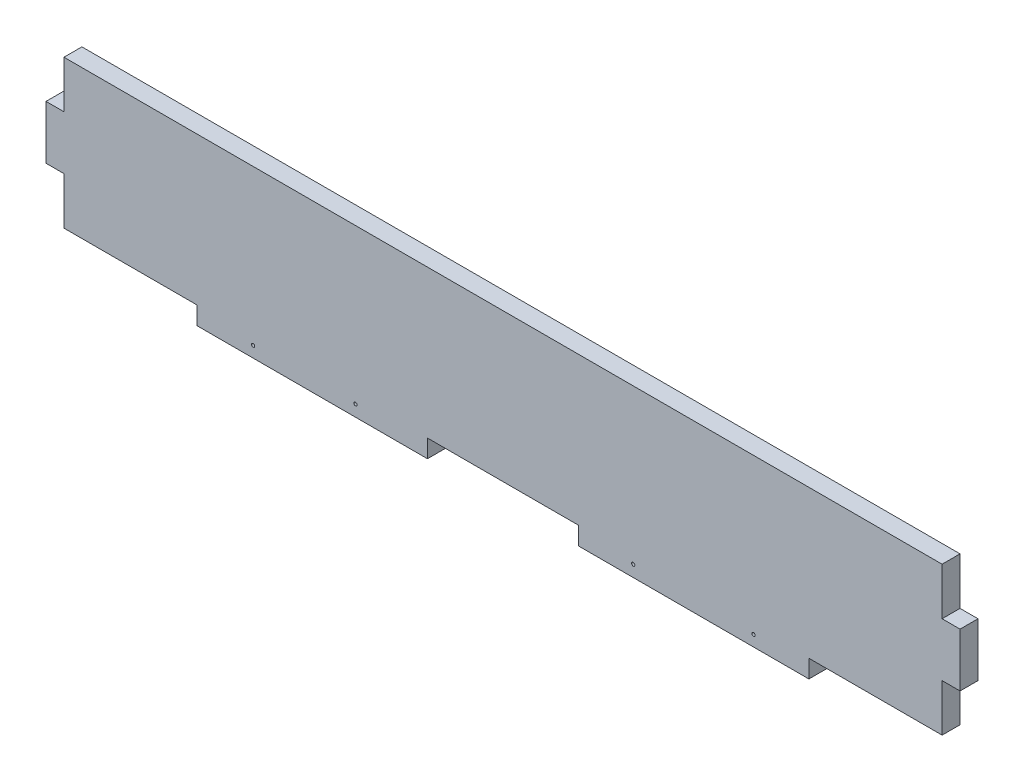
ISO-10303-21;
HEADER;
FILE_DESCRIPTION(('STEP AP214'),'2;1');
FILE_NAME('part.step','',(''),(''),'','','');
FILE_SCHEMA(('AUTOMOTIVE_DESIGN { 1 0 10303 214 1 1 1 1 }'));
ENDSEC;
DATA;
#1=APPLICATION_CONTEXT('core data for automotive mechanical design processes');
#2=APPLICATION_PROTOCOL_DEFINITION('international standard','automotive_design',2000,#1);
#3=PRODUCT_CONTEXT('',#1,'mechanical');
#4=PRODUCT('Part','Part','',(#3));
#5=PRODUCT_RELATED_PRODUCT_CATEGORY('part','',(#4));
#6=PRODUCT_DEFINITION_FORMATION('','',#4);
#7=PRODUCT_DEFINITION_CONTEXT('part definition',#1,'design');
#8=PRODUCT_DEFINITION('design','',#6,#7);
#9=PRODUCT_DEFINITION_SHAPE('','',#8);
#10=(LENGTH_UNIT() NAMED_UNIT(*) SI_UNIT(.MILLI.,.METRE.));
#11=(NAMED_UNIT(*) PLANE_ANGLE_UNIT() SI_UNIT($,.RADIAN.));
#12=(NAMED_UNIT(*) SI_UNIT($,.STERADIAN.) SOLID_ANGLE_UNIT());
#13=UNCERTAINTY_MEASURE_WITH_UNIT(LENGTH_MEASURE(1.E-05),#10,'distance_accuracy_value','');
#14=(GEOMETRIC_REPRESENTATION_CONTEXT(3) GLOBAL_UNCERTAINTY_ASSIGNED_CONTEXT((#13)) GLOBAL_UNIT_ASSIGNED_CONTEXT((#10,
#11,#12)) REPRESENTATION_CONTEXT('',''));
#15=CARTESIAN_POINT('',(0.,0.,0.));
#16=DIRECTION('',(0.,0.,1.));
#17=DIRECTION('',(1.,0.,0.));
#18=AXIS2_PLACEMENT_3D('',#15,#16,#17);
#19=CARTESIAN_POINT('',(-929.418408841076,3374.03154429096,208.));
#20=DIRECTION('',(-1.,0.,0.));
#21=DIRECTION('',(0.,0.,1.));
#22=AXIS2_PLACEMENT_3D('',#19,#20,#21);
#23=PLANE('',#22);
#24=DIRECTION('',(0.,1.,0.));
#25=VECTOR('',#24,1.);
#26=CARTESIAN_POINT('',(-929.418408841076,3374.03154429096,189.));
#27=LINE('',#26,#25);
#28=CARTESIAN_POINT('',(-929.418408841076,3267.30154429096,189.));
#29=VERTEX_POINT('',#28);
#30=CARTESIAN_POINT('',(-929.418408841076,3324.02154429096,189.));
#31=VERTEX_POINT('',#30);
#32=EDGE_CURVE('E343',#29,#31,#27,.T.);
#33=ORIENTED_EDGE('',*,*,#32,.T.);
#34=DIRECTION('',(0.,0.,-1.));
#35=VECTOR('',#34,1.);
#36=CARTESIAN_POINT('',(-929.418408841076,3324.02154429096,208.));
#37=LINE('',#36,#35);
#38=CARTESIAN_POINT('',(-929.418408841076,3324.02154429096,208.));
#39=VERTEX_POINT('',#38);
#40=EDGE_CURVE('E178',#39,#31,#37,.T.);
#41=ORIENTED_EDGE('',*,*,#40,.F.);
#42=DIRECTION('',(0.,1.,0.));
#43=VECTOR('',#42,1.);
#44=CARTESIAN_POINT('',(-929.418408841076,3374.03154429096,208.));
#45=LINE('',#44,#43);
#46=CARTESIAN_POINT('',(-929.418408841076,3267.30154429096,208.));
#47=VERTEX_POINT('',#46);
#48=EDGE_CURVE('E344',#47,#39,#45,.T.);
#49=ORIENTED_EDGE('',*,*,#48,.F.);
#50=DIRECTION('',(0.,0.,1.));
#51=VECTOR('',#50,1.);
#52=CARTESIAN_POINT('',(-929.418408841076,3267.30154429096,208.));
#53=LINE('',#52,#51);
#54=EDGE_CURVE('E224',#29,#47,#53,.T.);
#55=ORIENTED_EDGE('',*,*,#54,.F.);
#56=EDGE_LOOP('',(#33,#41,#49,#55));
#57=FACE_BOUND('',#56,.T.);
#58=ADVANCED_FACE('F33',(#57),#23,.F.);
#59=CARTESIAN_POINT('',(-929.418408841076,3198.29154429096,208.));
#60=DIRECTION('',(0.,1.,0.));
#61=DIRECTION('',(0.,0.,1.));
#62=AXIS2_PLACEMENT_3D('',#59,#60,#61);
#63=PLANE('',#62);
#64=DIRECTION('',(0.,0.,-1.));
#65=VECTOR('',#64,1.);
#66=CARTESIAN_POINT('',(-1089.42840884108,3198.29154429096,208.));
#67=LINE('',#66,#65);
#68=CARTESIAN_POINT('',(-1089.42840884108,3198.29154429096,208.));
#69=VERTEX_POINT('',#68);
#70=CARTESIAN_POINT('',(-1089.42840884108,3198.29154429096,189.));
#71=VERTEX_POINT('',#70);
#72=EDGE_CURVE('E302',#69,#71,#67,.T.);
#73=ORIENTED_EDGE('',*,*,#72,.F.);
#74=DIRECTION('',(1.,0.,0.));
#75=VECTOR('',#74,1.);
#76=CARTESIAN_POINT('',(-929.418408841076,3198.29154429096,208.));
#77=LINE('',#76,#75);
#78=CARTESIAN_POINT('',(-1333.20840884108,3198.29154429096,208.));
#79=VERTEX_POINT('',#78);
#80=EDGE_CURVE('E353',#79,#69,#77,.T.);
#81=ORIENTED_EDGE('',*,*,#80,.F.);
#82=DIRECTION('',(0.,0.,1.));
#83=VECTOR('',#82,1.);
#84=CARTESIAN_POINT('',(-1333.20840884108,3198.29154429096,208.));
#85=LINE('',#84,#83);
#86=CARTESIAN_POINT('',(-1333.20840884108,3198.29154429096,189.));
#87=VERTEX_POINT('',#86);
#88=EDGE_CURVE('E300',#87,#79,#85,.T.);
#89=ORIENTED_EDGE('',*,*,#88,.F.);
#90=DIRECTION('',(1.,0.,0.));
#91=VECTOR('',#90,1.);
#92=CARTESIAN_POINT('',(-929.418408841076,3198.29154429096,189.));
#93=LINE('',#92,#91);
#94=EDGE_CURVE('E362',#87,#71,#93,.T.);
#95=ORIENTED_EDGE('',*,*,#94,.T.);
#96=EDGE_LOOP('',(#73,#81,#89,#95));
#97=FACE_BOUND('',#96,.T.);
#98=ADVANCED_FACE('F380',(#97),#63,.F.);
#99=DIRECTION('',(0.,0.,-1.));
#100=VECTOR('',#99,1.);
#101=CARTESIAN_POINT('',(-1493.22840884108,3198.29154429096,208.));
#102=LINE('',#101,#100);
#103=CARTESIAN_POINT('',(-1493.22840884108,3198.29154429096,208.));
#104=VERTEX_POINT('',#103);
#105=CARTESIAN_POINT('',(-1493.22840884108,3198.29154429096,189.));
#106=VERTEX_POINT('',#105);
#107=EDGE_CURVE('E298',#104,#106,#102,.T.);
#108=ORIENTED_EDGE('',*,*,#107,.F.);
#109=CARTESIAN_POINT('',(-1737.00840884108,3198.29154429096,208.));
#110=VERTEX_POINT('',#109);
#111=EDGE_CURVE('E356',#110,#104,#77,.T.);
#112=ORIENTED_EDGE('',*,*,#111,.F.);
#113=DIRECTION('',(0.,0.,1.));
#114=VECTOR('',#113,1.);
#115=CARTESIAN_POINT('',(-1737.00840884108,3198.29154429096,208.));
#116=LINE('',#115,#114);
#117=CARTESIAN_POINT('',(-1737.00840884108,3198.29154429096,189.));
#118=VERTEX_POINT('',#117);
#119=EDGE_CURVE('E230',#118,#110,#116,.T.);
#120=ORIENTED_EDGE('',*,*,#119,.F.);
#121=EDGE_CURVE('E348',#118,#106,#93,.T.);
#122=ORIENTED_EDGE('',*,*,#121,.T.);
#123=EDGE_LOOP('',(#108,#112,#120,#122));
#124=FACE_BOUND('',#123,.T.);
#125=ADVANCED_FACE('F394',(#124),#63,.F.);
#126=CARTESIAN_POINT('',(0.,0.,208.));
#127=DIRECTION('',(0.,0.,-1.));
#128=DIRECTION('',(-1.,0.,0.));
#129=AXIS2_PLACEMENT_3D('',#126,#127,#128);
#130=PLANE('',#129);
#131=CARTESIAN_POINT('',(-1148.04493942285,3209.86722089998,208.));
#132=DIRECTION('',(0.,0.,-1.));
#133=DIRECTION('',(-1.,0.,0.));
#134=AXIS2_PLACEMENT_3D('',#131,#132,#133);
#135=CIRCLE('',#134,1.70000000000003);
#136=CARTESIAN_POINT('',(-1149.74493942285,3209.86722089998,208.));
#137=VERTEX_POINT('',#136);
#138=EDGE_CURVE('E485',#137,#137,#135,.T.);
#139=ORIENTED_EDGE('',*,*,#138,.T.);
#140=EDGE_LOOP('',(#139));
#141=FACE_BOUND('',#140,.T.);
#142=CARTESIAN_POINT('',(-1275.39820574207,3210.48579021909,208.));
#143=DIRECTION('',(0.,0.,-1.));
#144=DIRECTION('',(-1.,0.,0.));
#145=AXIS2_PLACEMENT_3D('',#142,#143,#144);
#146=CIRCLE('',#145,1.70000000000003);
#147=CARTESIAN_POINT('',(-1277.09820574207,3210.48579021909,208.));
#148=VERTEX_POINT('',#147);
#149=EDGE_CURVE('E489',#148,#148,#146,.T.);
#150=ORIENTED_EDGE('',*,*,#149,.T.);
#151=EDGE_LOOP('',(#150));
#152=FACE_BOUND('',#151,.T.);
#153=CARTESIAN_POINT('',(-1569.39828744184,3210.35876800607,208.));
#154=DIRECTION('',(0.,0.,-1.));
#155=DIRECTION('',(-1.,0.,0.));
#156=AXIS2_PLACEMENT_3D('',#153,#154,#155);
#157=CIRCLE('',#156,1.70000000000003);
#158=CARTESIAN_POINT('',(-1571.09828744184,3210.35876800607,208.));
#159=VERTEX_POINT('',#158);
#160=EDGE_CURVE('E493',#159,#159,#157,.T.);
#161=ORIENTED_EDGE('',*,*,#160,.T.);
#162=EDGE_LOOP('',(#161));
#163=FACE_BOUND('',#162,.T.);
#164=CARTESIAN_POINT('',(-1677.74929869736,3210.03773707743,208.));
#165=DIRECTION('',(0.,0.,-1.));
#166=DIRECTION('',(-1.,0.,0.));
#167=AXIS2_PLACEMENT_3D('',#164,#165,#166);
#168=CIRCLE('',#167,1.70000000000003);
#169=CARTESIAN_POINT('',(-1679.44929869736,3210.03773707743,208.));
#170=VERTEX_POINT('',#169);
#171=EDGE_CURVE('E188',#170,#170,#168,.T.);
#172=ORIENTED_EDGE('',*,*,#171,.T.);
#173=EDGE_LOOP('',(#172));
#174=FACE_BOUND('',#173,.T.);
#175=ORIENTED_EDGE('',*,*,#48,.T.);
#176=DIRECTION('',(-1.,0.,0.));
#177=VECTOR('',#176,1.);
#178=CARTESIAN_POINT('',(-948.428408841075,3324.02154429096,208.));
#179=LINE('',#178,#177);
#180=CARTESIAN_POINT('',(-948.428408841075,3324.02154429096,208.));
#181=VERTEX_POINT('',#180);
#182=EDGE_CURVE('E182',#39,#181,#179,.T.);
#183=ORIENTED_EDGE('',*,*,#182,.T.);
#184=DIRECTION('',(0.,1.,0.));
#185=VECTOR('',#184,1.);
#186=CARTESIAN_POINT('',(-948.428408841075,3374.04154429096,208.));
#187=LINE('',#186,#185);
#188=CARTESIAN_POINT('',(-948.428408841075,3374.03154429096,208.));
#189=VERTEX_POINT('',#188);
#190=EDGE_CURVE('E170',#181,#189,#187,.T.);
#191=ORIENTED_EDGE('',*,*,#190,.T.);
#192=DIRECTION('',(-1.,0.,0.));
#193=VECTOR('',#192,1.);
#194=CARTESIAN_POINT('',(-929.418408841076,3374.03154429096,208.));
#195=LINE('',#194,#193);
#196=CARTESIAN_POINT('',(-1878.00840884108,3374.03154429096,208.));
#197=VERTEX_POINT('',#196);
#198=EDGE_CURVE('E347',#189,#197,#195,.T.);
#199=ORIENTED_EDGE('',*,*,#198,.T.);
#200=DIRECTION('',(0.,1.,0.));
#201=VECTOR('',#200,1.);
#202=CARTESIAN_POINT('',(-1878.00840884108,3374.04154429096,208.));
#203=LINE('',#202,#201);
#204=CARTESIAN_POINT('',(-1878.00840884108,3324.02154429096,208.));
#205=VERTEX_POINT('',#204);
#206=EDGE_CURVE('E305',#205,#197,#203,.T.);
#207=ORIENTED_EDGE('',*,*,#206,.F.);
#208=DIRECTION('',(1.,0.,0.));
#209=VECTOR('',#208,1.);
#210=CARTESIAN_POINT('',(-1878.00840884108,3324.02154429096,208.));
#211=LINE('',#210,#209);
#212=CARTESIAN_POINT('',(-1897.01840884108,3324.02154429096,208.));
#213=VERTEX_POINT('',#212);
#214=EDGE_CURVE('E308',#213,#205,#211,.T.);
#215=ORIENTED_EDGE('',*,*,#214,.F.);
#216=DIRECTION('',(0.,-1.,0.));
#217=VECTOR('',#216,1.);
#218=CARTESIAN_POINT('',(-1897.01840884108,3374.03154429096,208.));
#219=LINE('',#218,#217);
#220=CARTESIAN_POINT('',(-1897.01840884108,3267.30154429096,208.));
#221=VERTEX_POINT('',#220);
#222=EDGE_CURVE('E350',#213,#221,#219,.T.);
#223=ORIENTED_EDGE('',*,*,#222,.T.);
#224=DIRECTION('',(-1.,0.,0.));
#225=VECTOR('',#224,1.);
#226=CARTESIAN_POINT('',(-1897.02840884108,3267.30154429096,208.));
#227=LINE('',#226,#225);
#228=CARTESIAN_POINT('',(-1878.00840884108,3267.30154429096,208.));
#229=VERTEX_POINT('',#228);
#230=EDGE_CURVE('E322',#229,#221,#227,.T.);
#231=ORIENTED_EDGE('',*,*,#230,.F.);
#232=DIRECTION('',(0.,1.,0.));
#233=VECTOR('',#232,1.);
#234=CARTESIAN_POINT('',(-1878.00840884108,3267.30154429096,208.));
#235=LINE('',#234,#233);
#236=CARTESIAN_POINT('',(-1878.00840884108,3217.30154429096,208.));
#237=VERTEX_POINT('',#236);
#238=EDGE_CURVE('E316',#237,#229,#235,.T.);
#239=ORIENTED_EDGE('',*,*,#238,.F.);
#240=DIRECTION('',(1.,0.,0.));
#241=VECTOR('',#240,1.);
#242=CARTESIAN_POINT('',(-1737.00840884108,3217.30154429096,208.));
#243=LINE('',#242,#241);
#244=CARTESIAN_POINT('',(-1737.00840884108,3217.30154429096,208.));
#245=VERTEX_POINT('',#244);
#246=EDGE_CURVE('E277',#237,#245,#243,.T.);
#247=ORIENTED_EDGE('',*,*,#246,.T.);
#248=DIRECTION('',(0.,-1.,0.));
#249=VECTOR('',#248,1.);
#250=CARTESIAN_POINT('',(-1737.00840884108,3198.28154429097,208.));
#251=LINE('',#250,#249);
#252=EDGE_CURVE('E258',#245,#110,#251,.T.);
#253=ORIENTED_EDGE('',*,*,#252,.T.);
#254=ORIENTED_EDGE('',*,*,#111,.T.);
#255=DIRECTION('',(0.,1.,0.));
#256=VECTOR('',#255,1.);
#257=CARTESIAN_POINT('',(-1493.22840884108,3217.30154429096,208.));
#258=LINE('',#257,#256);
#259=CARTESIAN_POINT('',(-1493.22840884108,3217.30154429096,208.));
#260=VERTEX_POINT('',#259);
#261=EDGE_CURVE('E238',#104,#260,#258,.T.);
#262=ORIENTED_EDGE('',*,*,#261,.T.);
#263=DIRECTION('',(1.,0.,0.));
#264=VECTOR('',#263,1.);
#265=CARTESIAN_POINT('',(-1333.20840884108,3217.30154429096,208.));
#266=LINE('',#265,#264);
#267=CARTESIAN_POINT('',(-1333.20840884108,3217.30154429096,208.));
#268=VERTEX_POINT('',#267);
#269=EDGE_CURVE('E249',#260,#268,#266,.T.);
#270=ORIENTED_EDGE('',*,*,#269,.T.);
#271=DIRECTION('',(0.,-1.,0.));
#272=VECTOR('',#271,1.);
#273=CARTESIAN_POINT('',(-1333.20840884108,3198.28154429097,208.));
#274=LINE('',#273,#272);
#275=EDGE_CURVE('E246',#268,#79,#274,.T.);
#276=ORIENTED_EDGE('',*,*,#275,.T.);
#277=ORIENTED_EDGE('',*,*,#80,.T.);
#278=DIRECTION('',(0.,1.,0.));
#279=VECTOR('',#278,1.);
#280=CARTESIAN_POINT('',(-1089.42840884108,3217.30154429096,208.));
#281=LINE('',#280,#279);
#282=CARTESIAN_POINT('',(-1089.42840884108,3217.30154429096,208.));
#283=VERTEX_POINT('',#282);
#284=EDGE_CURVE('E227',#69,#283,#281,.T.);
#285=ORIENTED_EDGE('',*,*,#284,.T.);
#286=DIRECTION('',(1.,0.,0.));
#287=VECTOR('',#286,1.);
#288=CARTESIAN_POINT('',(-929.408408841076,3217.30154429096,208.));
#289=LINE('',#288,#287);
#290=CARTESIAN_POINT('',(-948.428408841075,3217.30154429096,208.));
#291=VERTEX_POINT('',#290);
#292=EDGE_CURVE('E231',#283,#291,#289,.T.);
#293=ORIENTED_EDGE('',*,*,#292,.T.);
#294=DIRECTION('',(0.,1.,0.));
#295=VECTOR('',#294,1.);
#296=CARTESIAN_POINT('',(-948.428408841075,3267.30154429096,208.));
#297=LINE('',#296,#295);
#298=CARTESIAN_POINT('',(-948.428408841075,3267.30154429096,208.));
#299=VERTEX_POINT('',#298);
#300=EDGE_CURVE('E55',#291,#299,#297,.T.);
#301=ORIENTED_EDGE('',*,*,#300,.T.);
#302=DIRECTION('',(1.,0.,0.));
#303=VECTOR('',#302,1.);
#304=CARTESIAN_POINT('',(-929.408408841075,3267.30154429096,208.));
#305=LINE('',#304,#303);
#306=EDGE_CURVE('E221',#299,#47,#305,.T.);
#307=ORIENTED_EDGE('',*,*,#306,.T.);
#308=EDGE_LOOP('',(#175,#183,#191,#199,#207,#215,#223,#231,#239,#247,#253,#254,#262,#270,#276,
#277,#285,#293,#301,#307));
#309=FACE_BOUND('',#308,.T.);
#310=ADVANCED_FACE('F382',(#141,#152,#163,#174,#309),#130,.F.);
#311=CARTESIAN_POINT('',(0.,0.,189.));
#312=DIRECTION('',(0.,0.,-1.));
#313=DIRECTION('',(-1.,0.,0.));
#314=AXIS2_PLACEMENT_3D('',#311,#312,#313);
#315=PLANE('',#314);
#316=CARTESIAN_POINT('',(-1148.04493942285,3209.86722089998,189.));
#317=DIRECTION('',(0.,0.,-1.));
#318=DIRECTION('',(-1.,0.,0.));
#319=AXIS2_PLACEMENT_3D('',#316,#317,#318);
#320=CIRCLE('',#319,1.70000000000003);
#321=CARTESIAN_POINT('',(-1149.74493942285,3209.86722089998,189.));
#322=VERTEX_POINT('',#321);
#323=EDGE_CURVE('E514',#322,#322,#320,.T.);
#324=ORIENTED_EDGE('',*,*,#323,.F.);
#325=EDGE_LOOP('',(#324));
#326=FACE_BOUND('',#325,.T.);
#327=CARTESIAN_POINT('',(-1275.39820574207,3210.48579021909,189.));
#328=DIRECTION('',(0.,0.,-1.));
#329=DIRECTION('',(-1.,0.,0.));
#330=AXIS2_PLACEMENT_3D('',#327,#328,#329);
#331=CIRCLE('',#330,1.70000000000003);
#332=CARTESIAN_POINT('',(-1277.09820574207,3210.48579021909,189.));
#333=VERTEX_POINT('',#332);
#334=EDGE_CURVE('E510',#333,#333,#331,.T.);
#335=ORIENTED_EDGE('',*,*,#334,.F.);
#336=EDGE_LOOP('',(#335));
#337=FACE_BOUND('',#336,.T.);
#338=CARTESIAN_POINT('',(-1569.39828744184,3210.35876800607,189.));
#339=DIRECTION('',(0.,0.,-1.));
#340=DIRECTION('',(-1.,0.,0.));
#341=AXIS2_PLACEMENT_3D('',#338,#339,#340);
#342=CIRCLE('',#341,1.70000000000003);
#343=CARTESIAN_POINT('',(-1571.09828744184,3210.35876800607,189.));
#344=VERTEX_POINT('',#343);
#345=EDGE_CURVE('E504',#344,#344,#342,.T.);
#346=ORIENTED_EDGE('',*,*,#345,.F.);
#347=EDGE_LOOP('',(#346));
#348=FACE_BOUND('',#347,.T.);
#349=CARTESIAN_POINT('',(-1677.74929869736,3210.03773707743,189.));
#350=DIRECTION('',(0.,0.,-1.));
#351=DIRECTION('',(-1.,0.,0.));
#352=AXIS2_PLACEMENT_3D('',#349,#350,#351);
#353=CIRCLE('',#352,1.70000000000003);
#354=CARTESIAN_POINT('',(-1679.44929869736,3210.03773707743,189.));
#355=VERTEX_POINT('',#354);
#356=EDGE_CURVE('E191',#355,#355,#353,.T.);
#357=ORIENTED_EDGE('',*,*,#356,.F.);
#358=EDGE_LOOP('',(#357));
#359=FACE_BOUND('',#358,.T.);
#360=CARTESIAN_POINT('',(-948.428408841075,3324.02154429096,189.));
#361=CARTESIAN_POINT('',(-929.408408841075,3324.02154429096,189.));
#362=B_SPLINE_CURVE_WITH_KNOTS('',1,(#360,#361),.UNSPECIFIED.,.F.,.F.,(2,2),(0.,
0.137746234067208),.UNSPECIFIED.);
#363=CARTESIAN_POINT('',(-948.428408841075,3324.02154429096,189.));
#364=VERTEX_POINT('',#363);
#365=EDGE_CURVE('E175',#364,#31,#362,.T.);
#366=ORIENTED_EDGE('',*,*,#365,.T.);
#367=ORIENTED_EDGE('',*,*,#32,.F.);
#368=DIRECTION('',(-1.,0.,0.));
#369=VECTOR('',#368,1.);
#370=CARTESIAN_POINT('',(-2826.43681768215,3267.30154429096,189.));
#371=LINE('',#370,#369);
#372=CARTESIAN_POINT('',(-948.428408841075,3267.30154429096,189.));
#373=VERTEX_POINT('',#372);
#374=EDGE_CURVE('E215',#29,#373,#371,.T.);
#375=ORIENTED_EDGE('',*,*,#374,.T.);
#376=CARTESIAN_POINT('',(-948.428408841075,3267.30154429096,189.));
#377=CARTESIAN_POINT('',(-948.428408841075,3217.28154429096,189.));
#378=B_SPLINE_CURVE_WITH_KNOTS('',1,(#376,#377),.UNSPECIFIED.,.F.,.F.,(2,2),(0.637746234067208,
1.),.UNSPECIFIED.);
#379=CARTESIAN_POINT('',(-948.428408841075,3217.30154429096,189.));
#380=VERTEX_POINT('',#379);
#381=EDGE_CURVE('E210',#373,#380,#378,.T.);
#382=ORIENTED_EDGE('',*,*,#381,.T.);
#383=DIRECTION('',(-1.,0.,0.));
#384=VECTOR('',#383,1.);
#385=CARTESIAN_POINT('',(0.,3217.30154429096,189.));
#386=LINE('',#385,#384);
#387=CARTESIAN_POINT('',(-1089.42840884108,3217.30154429096,189.));
#388=VERTEX_POINT('',#387);
#389=EDGE_CURVE('E11',#380,#388,#386,.T.);
#390=ORIENTED_EDGE('',*,*,#389,.T.);
#391=CARTESIAN_POINT('',(-1089.42840884108,3217.30154429096,189.));
#392=CARTESIAN_POINT('',(-1089.42840884108,3198.28154429097,189.));
#393=B_SPLINE_CURVE_WITH_KNOTS('',1,(#391,#392),.UNSPECIFIED.,.F.,.F.,(2,2),(0.,
0.0531166219839137),.UNSPECIFIED.);
#394=EDGE_CURVE('E232',#388,#71,#393,.T.);
#395=ORIENTED_EDGE('',*,*,#394,.T.);
#396=ORIENTED_EDGE('',*,*,#94,.F.);
#397=DIRECTION('',(0.,1.,0.));
#398=VECTOR('',#397,1.);
#399=CARTESIAN_POINT('',(-1333.20840884108,0.,189.));
#400=LINE('',#399,#398);
#401=CARTESIAN_POINT('',(-1333.20840884108,3217.30154429096,189.));
#402=VERTEX_POINT('',#401);
#403=EDGE_CURVE('E40',#87,#402,#400,.T.);
#404=ORIENTED_EDGE('',*,*,#403,.T.);
#405=CARTESIAN_POINT('',(-1333.20840884108,3217.30154429096,189.));
#406=CARTESIAN_POINT('',(-1493.22840884108,3217.30154429096,189.));
#407=B_SPLINE_CURVE_WITH_KNOTS('',1,(#405,#406),.UNSPECIFIED.,.F.,.F.,(2,2),(0.553116621983914,
1.),.UNSPECIFIED.);
#408=CARTESIAN_POINT('',(-1493.22840884108,3217.30154429096,189.));
#409=VERTEX_POINT('',#408);
#410=EDGE_CURVE('E257',#402,#409,#407,.T.);
#411=ORIENTED_EDGE('',*,*,#410,.T.);
#412=CARTESIAN_POINT('',(-1493.22840884108,3217.30154429096,189.));
#413=CARTESIAN_POINT('',(-1493.22840884108,3198.28154429097,189.));
#414=B_SPLINE_CURVE_WITH_KNOTS('',1,(#412,#413),.UNSPECIFIED.,.F.,.F.,(2,2),(0.,
0.0531166219839137),.UNSPECIFIED.);
#415=EDGE_CURVE('E252',#409,#106,#414,.T.);
#416=ORIENTED_EDGE('',*,*,#415,.T.);
#417=ORIENTED_EDGE('',*,*,#121,.F.);
#418=CARTESIAN_POINT('',(-1737.00840884108,3198.28154429097,189.));
#419=CARTESIAN_POINT('',(-1737.00840884108,3217.30154429096,189.));
#420=B_SPLINE_CURVE_WITH_KNOTS('',1,(#418,#419),.UNSPECIFIED.,.F.,.F.,(2,2),(0.5,
0.553116621983914),.UNSPECIFIED.);
#421=CARTESIAN_POINT('',(-1737.00840884108,3217.30154429096,189.));
#422=VERTEX_POINT('',#421);
#423=EDGE_CURVE('E226',#118,#422,#420,.T.);
#424=ORIENTED_EDGE('',*,*,#423,.T.);
#425=CARTESIAN_POINT('',(-1737.00840884108,3217.30154429096,189.));
#426=CARTESIAN_POINT('',(-1897.02840884108,3217.30154429096,189.));
#427=B_SPLINE_CURVE_WITH_KNOTS('',1,(#425,#426),.UNSPECIFIED.,.F.,.F.,(2,2),(0.553116621983914,
1.),.UNSPECIFIED.);
#428=CARTESIAN_POINT('',(-1878.00840884108,3217.30154429096,189.));
#429=VERTEX_POINT('',#428);
#430=EDGE_CURVE('E282',#422,#429,#427,.T.);
#431=ORIENTED_EDGE('',*,*,#430,.T.);
#432=CARTESIAN_POINT('',(-1878.00840884108,3267.30154429096,189.));
#433=CARTESIAN_POINT('',(-1878.00840884108,3217.28154429096,189.));
#434=B_SPLINE_CURVE_WITH_KNOTS('',1,(#432,#433),.UNSPECIFIED.,.F.,.F.,(2,2),(0.637746234067208,
1.),.UNSPECIFIED.);
#435=CARTESIAN_POINT('',(-1878.00840884108,3267.30154429096,189.));
#436=VERTEX_POINT('',#435);
#437=EDGE_CURVE('E304',#436,#429,#434,.T.);
#438=ORIENTED_EDGE('',*,*,#437,.F.);
#439=DIRECTION('',(1.,0.,0.));
#440=VECTOR('',#439,1.);
#441=CARTESIAN_POINT('',(0.,3267.30154429096,189.));
#442=LINE('',#441,#440);
#443=CARTESIAN_POINT('',(-1897.01840884108,3267.30154429096,189.));
#444=VERTEX_POINT('',#443);
#445=EDGE_CURVE('E365',#444,#436,#442,.T.);
#446=ORIENTED_EDGE('',*,*,#445,.F.);
#447=DIRECTION('',(0.,-1.,0.));
#448=VECTOR('',#447,1.);
#449=CARTESIAN_POINT('',(-1897.01840884108,3374.03154429096,189.));
#450=LINE('',#449,#448);
#451=CARTESIAN_POINT('',(-1897.01840884108,3324.02154429096,189.));
#452=VERTEX_POINT('',#451);
#453=EDGE_CURVE('E359',#452,#444,#450,.T.);
#454=ORIENTED_EDGE('',*,*,#453,.F.);
#455=CARTESIAN_POINT('',(-1878.00840884108,3324.02154429096,189.));
#456=CARTESIAN_POINT('',(-1897.02840884108,3324.02154429096,189.));
#457=B_SPLINE_CURVE_WITH_KNOTS('',1,(#455,#456),.UNSPECIFIED.,.F.,.F.,(2,2),(0.,
0.137746234067208),.UNSPECIFIED.);
#458=CARTESIAN_POINT('',(-1878.00840884108,3324.02154429096,189.));
#459=VERTEX_POINT('',#458);
#460=EDGE_CURVE('E312',#459,#452,#457,.T.);
#461=ORIENTED_EDGE('',*,*,#460,.F.);
#462=DIRECTION('',(0.,-1.,0.));
#463=VECTOR('',#462,1.);
#464=CARTESIAN_POINT('',(-1878.00840884108,0.,189.));
#465=LINE('',#464,#463);
#466=CARTESIAN_POINT('',(-1878.00840884108,3374.03154429096,189.));
#467=VERTEX_POINT('',#466);
#468=EDGE_CURVE('E367',#467,#459,#465,.T.);
#469=ORIENTED_EDGE('',*,*,#468,.F.);
#470=DIRECTION('',(-1.,0.,0.));
#471=VECTOR('',#470,1.);
#472=CARTESIAN_POINT('',(-929.418408841076,3374.03154429096,189.));
#473=LINE('',#472,#471);
#474=CARTESIAN_POINT('',(-948.428408841075,3374.03154429096,189.));
#475=VERTEX_POINT('',#474);
#476=EDGE_CURVE('E187',#475,#467,#473,.T.);
#477=ORIENTED_EDGE('',*,*,#476,.F.);
#478=DIRECTION('',(0.,-1.,0.));
#479=VECTOR('',#478,1.);
#480=CARTESIAN_POINT('',(-948.428408841075,0.,189.));
#481=LINE('',#480,#479);
#482=EDGE_CURVE('E47',#475,#364,#481,.T.);
#483=ORIENTED_EDGE('',*,*,#482,.T.);
#484=EDGE_LOOP('',(#366,#367,#375,#382,#390,#395,#396,#404,#411,#416,#417,#424,#431,#438,#446,
#454,#461,#469,#477,#483));
#485=FACE_BOUND('',#484,.T.);
#486=ADVANCED_FACE('F185',(#326,#337,#348,#359,#485),#315,.T.);
#487=CARTESIAN_POINT('',(-1878.00840884108,3267.30154429096,227.));
#488=DIRECTION('',(1.,0.,0.));
#489=DIRECTION('',(0.,0.,-1.));
#490=AXIS2_PLACEMENT_3D('',#487,#488,#489);
#491=PLANE('',#490);
#492=DIRECTION('',(0.,0.,-1.));
#493=VECTOR('',#492,1.);
#494=CARTESIAN_POINT('',(-1878.00840884108,3217.30154429096,227.));
#495=LINE('',#494,#493);
#496=EDGE_CURVE('E369',#237,#429,#495,.T.);
#497=ORIENTED_EDGE('',*,*,#496,.F.);
#498=ORIENTED_EDGE('',*,*,#238,.T.);
#499=DIRECTION('',(0.,0.,-1.));
#500=VECTOR('',#499,1.);
#501=CARTESIAN_POINT('',(-1878.00840884108,3267.30154429096,227.));
#502=LINE('',#501,#500);
#503=EDGE_CURVE('E324',#229,#436,#502,.T.);
#504=ORIENTED_EDGE('',*,*,#503,.T.);
#505=ORIENTED_EDGE('',*,*,#437,.T.);
#506=EDGE_LOOP('',(#497,#498,#504,#505));
#507=FACE_BOUND('',#506,.T.);
#508=ADVANCED_FACE('F407',(#507),#491,.F.);
#509=CARTESIAN_POINT('',(-929.418408841076,3374.03154429096,208.));
#510=DIRECTION('',(0.,-1.,0.));
#511=DIRECTION('',(0.,0.,-1.));
#512=AXIS2_PLACEMENT_3D('',#509,#510,#511);
#513=PLANE('',#512);
#514=ORIENTED_EDGE('',*,*,#198,.F.);
#515=DIRECTION('',(0.,0.,1.));
#516=VECTOR('',#515,1.);
#517=CARTESIAN_POINT('',(-948.428408841075,3374.03154429096,208.));
#518=LINE('',#517,#516);
#519=EDGE_CURVE('E196',#475,#189,#518,.T.);
#520=ORIENTED_EDGE('',*,*,#519,.F.);
#521=ORIENTED_EDGE('',*,*,#476,.T.);
#522=DIRECTION('',(0.,0.,1.));
#523=VECTOR('',#522,1.);
#524=CARTESIAN_POINT('',(-1878.00840884108,3374.03154429096,208.));
#525=LINE('',#524,#523);
#526=EDGE_CURVE('E337',#467,#197,#525,.T.);
#527=ORIENTED_EDGE('',*,*,#526,.T.);
#528=EDGE_LOOP('',(#514,#520,#521,#527));
#529=FACE_BOUND('',#528,.T.);
#530=ADVANCED_FACE('F427',(#529),#513,.F.);
#531=CARTESIAN_POINT('',(-1897.01840884108,3374.03154429096,208.));
#532=DIRECTION('',(1.,0.,0.));
#533=DIRECTION('',(0.,0.,-1.));
#534=AXIS2_PLACEMENT_3D('',#531,#532,#533);
#535=PLANE('',#534);
#536=ORIENTED_EDGE('',*,*,#222,.F.);
#537=DIRECTION('',(0.,0.,-1.));
#538=VECTOR('',#537,1.);
#539=CARTESIAN_POINT('',(-1897.01840884108,3324.02154429096,208.));
#540=LINE('',#539,#538);
#541=EDGE_CURVE('E340',#213,#452,#540,.T.);
#542=ORIENTED_EDGE('',*,*,#541,.T.);
#543=ORIENTED_EDGE('',*,*,#453,.T.);
#544=DIRECTION('',(0.,0.,1.));
#545=VECTOR('',#544,1.);
#546=CARTESIAN_POINT('',(-1897.01840884108,3267.30154429096,208.));
#547=LINE('',#546,#545);
#548=EDGE_CURVE('E311',#444,#221,#547,.T.);
#549=ORIENTED_EDGE('',*,*,#548,.T.);
#550=EDGE_LOOP('',(#536,#542,#543,#549));
#551=FACE_BOUND('',#550,.T.);
#552=ADVANCED_FACE('F416',(#551),#535,.F.);
#553=CARTESIAN_POINT('',(-1897.02840884108,3267.30154429096,227.));
#554=DIRECTION('',(0.,1.,0.));
#555=DIRECTION('',(0.,0.,1.));
#556=AXIS2_PLACEMENT_3D('',#553,#554,#555);
#557=PLANE('',#556);
#558=ORIENTED_EDGE('',*,*,#445,.T.);
#559=ORIENTED_EDGE('',*,*,#503,.F.);
#560=ORIENTED_EDGE('',*,*,#230,.T.);
#561=ORIENTED_EDGE('',*,*,#548,.F.);
#562=EDGE_LOOP('',(#558,#559,#560,#561));
#563=FACE_BOUND('',#562,.T.);
#564=ADVANCED_FACE('F464',(#563),#557,.F.);
#565=CARTESIAN_POINT('',(-1878.00840884108,3324.02154429096,227.));
#566=DIRECTION('',(0.,-1.,0.));
#567=DIRECTION('',(0.,0.,-1.));
#568=AXIS2_PLACEMENT_3D('',#565,#566,#567);
#569=PLANE('',#568);
#570=ORIENTED_EDGE('',*,*,#214,.T.);
#571=DIRECTION('',(0.,0.,-1.));
#572=VECTOR('',#571,1.);
#573=CARTESIAN_POINT('',(-1878.00840884108,3324.02154429096,227.));
#574=LINE('',#573,#572);
#575=EDGE_CURVE('E309',#205,#459,#574,.T.);
#576=ORIENTED_EDGE('',*,*,#575,.T.);
#577=ORIENTED_EDGE('',*,*,#460,.T.);
#578=ORIENTED_EDGE('',*,*,#541,.F.);
#579=EDGE_LOOP('',(#570,#576,#577,#578));
#580=FACE_BOUND('',#579,.T.);
#581=ADVANCED_FACE('F419',(#580),#569,.F.);
#582=CARTESIAN_POINT('',(-1878.00840884108,3374.04154429096,227.));
#583=DIRECTION('',(1.,0.,0.));
#584=DIRECTION('',(0.,0.,-1.));
#585=AXIS2_PLACEMENT_3D('',#582,#583,#584);
#586=PLANE('',#585);
#587=ORIENTED_EDGE('',*,*,#468,.T.);
#588=ORIENTED_EDGE('',*,*,#575,.F.);
#589=ORIENTED_EDGE('',*,*,#206,.T.);
#590=ORIENTED_EDGE('',*,*,#526,.F.);
#591=EDGE_LOOP('',(#587,#588,#589,#590));
#592=FACE_BOUND('',#591,.T.);
#593=ADVANCED_FACE('F425',(#592),#586,.F.);
#594=CARTESIAN_POINT('',(-1737.00840884108,3198.28154429097,227.));
#595=DIRECTION('',(-1.,0.,0.));
#596=DIRECTION('',(0.,0.,1.));
#597=AXIS2_PLACEMENT_3D('',#594,#595,#596);
#598=PLANE('',#597);
#599=ORIENTED_EDGE('',*,*,#119,.T.);
#600=ORIENTED_EDGE('',*,*,#252,.F.);
#601=DIRECTION('',(0.,0.,-1.));
#602=VECTOR('',#601,1.);
#603=CARTESIAN_POINT('',(-1737.00840884108,3217.30154429096,227.));
#604=LINE('',#603,#602);
#605=EDGE_CURVE('E290',#245,#422,#604,.T.);
#606=ORIENTED_EDGE('',*,*,#605,.T.);
#607=ORIENTED_EDGE('',*,*,#423,.F.);
#608=EDGE_LOOP('',(#599,#600,#606,#607));
#609=FACE_BOUND('',#608,.T.);
#610=ADVANCED_FACE('F398',(#609),#598,.T.);
#611=CARTESIAN_POINT('',(-1737.00840884108,3217.30154429096,227.));
#612=DIRECTION('',(0.,-1.,0.));
#613=DIRECTION('',(0.,0.,-1.));
#614=AXIS2_PLACEMENT_3D('',#611,#612,#613);
#615=PLANE('',#614);
#616=ORIENTED_EDGE('',*,*,#496,.T.);
#617=ORIENTED_EDGE('',*,*,#430,.F.);
#618=ORIENTED_EDGE('',*,*,#605,.F.);
#619=ORIENTED_EDGE('',*,*,#246,.F.);
#620=EDGE_LOOP('',(#616,#617,#618,#619));
#621=FACE_BOUND('',#620,.T.);
#622=ADVANCED_FACE('F404',(#621),#615,.T.);
#623=CARTESIAN_POINT('',(-1333.20840884108,3198.28154429097,227.));
#624=DIRECTION('',(-1.,0.,0.));
#625=DIRECTION('',(0.,0.,1.));
#626=AXIS2_PLACEMENT_3D('',#623,#624,#625);
#627=PLANE('',#626);
#628=ORIENTED_EDGE('',*,*,#88,.T.);
#629=ORIENTED_EDGE('',*,*,#275,.F.);
#630=DIRECTION('',(0.,0.,-1.));
#631=VECTOR('',#630,1.);
#632=CARTESIAN_POINT('',(-1333.20840884108,3217.30154429096,227.));
#633=LINE('',#632,#631);
#634=EDGE_CURVE('E271',#268,#402,#633,.T.);
#635=ORIENTED_EDGE('',*,*,#634,.T.);
#636=ORIENTED_EDGE('',*,*,#403,.F.);
#637=EDGE_LOOP('',(#628,#629,#635,#636));
#638=FACE_BOUND('',#637,.T.);
#639=ADVANCED_FACE('F375',(#638),#627,.T.);
#640=CARTESIAN_POINT('',(-1493.22840884108,3217.30154429096,227.));
#641=DIRECTION('',(1.,0.,0.));
#642=DIRECTION('',(0.,0.,-1.));
#643=AXIS2_PLACEMENT_3D('',#640,#641,#642);
#644=PLANE('',#643);
#645=ORIENTED_EDGE('',*,*,#107,.T.);
#646=ORIENTED_EDGE('',*,*,#415,.F.);
#647=DIRECTION('',(0.,0.,-1.));
#648=VECTOR('',#647,1.);
#649=CARTESIAN_POINT('',(-1493.22840884108,3217.30154429096,227.));
#650=LINE('',#649,#648);
#651=EDGE_CURVE('E266',#260,#409,#650,.T.);
#652=ORIENTED_EDGE('',*,*,#651,.F.);
#653=ORIENTED_EDGE('',*,*,#261,.F.);
#654=EDGE_LOOP('',(#645,#646,#652,#653));
#655=FACE_BOUND('',#654,.T.);
#656=ADVANCED_FACE('F388',(#655),#644,.T.);
#657=CARTESIAN_POINT('',(-1333.20840884108,3217.30154429096,227.));
#658=DIRECTION('',(0.,-1.,0.));
#659=DIRECTION('',(0.,0.,-1.));
#660=AXIS2_PLACEMENT_3D('',#657,#658,#659);
#661=PLANE('',#660);
#662=ORIENTED_EDGE('',*,*,#651,.T.);
#663=ORIENTED_EDGE('',*,*,#410,.F.);
#664=ORIENTED_EDGE('',*,*,#634,.F.);
#665=ORIENTED_EDGE('',*,*,#269,.F.);
#666=EDGE_LOOP('',(#662,#663,#664,#665));
#667=FACE_BOUND('',#666,.T.);
#668=ADVANCED_FACE('F384',(#667),#661,.T.);
#669=CARTESIAN_POINT('',(-929.408408841076,3217.30154429096,227.));
#670=DIRECTION('',(0.,-1.,0.));
#671=DIRECTION('',(0.,0.,-1.));
#672=AXIS2_PLACEMENT_3D('',#669,#670,#671);
#673=PLANE('',#672);
#674=DIRECTION('',(0.,0.,-1.));
#675=VECTOR('',#674,1.);
#676=CARTESIAN_POINT('',(-948.428408841075,3217.30154429096,227.));
#677=LINE('',#676,#675);
#678=EDGE_CURVE('E205',#291,#380,#677,.T.);
#679=ORIENTED_EDGE('',*,*,#678,.F.);
#680=ORIENTED_EDGE('',*,*,#292,.F.);
#681=DIRECTION('',(0.,0.,-1.));
#682=VECTOR('',#681,1.);
#683=CARTESIAN_POINT('',(-1089.42840884108,3217.30154429096,227.));
#684=LINE('',#683,#682);
#685=EDGE_CURVE('E237',#283,#388,#684,.T.);
#686=ORIENTED_EDGE('',*,*,#685,.T.);
#687=ORIENTED_EDGE('',*,*,#389,.F.);
#688=EDGE_LOOP('',(#679,#680,#686,#687));
#689=FACE_BOUND('',#688,.T.);
#690=ADVANCED_FACE('F438',(#689),#673,.T.);
#691=CARTESIAN_POINT('',(-1089.42840884108,3217.30154429096,227.));
#692=DIRECTION('',(1.,0.,0.));
#693=DIRECTION('',(0.,0.,-1.));
#694=AXIS2_PLACEMENT_3D('',#691,#692,#693);
#695=PLANE('',#694);
#696=ORIENTED_EDGE('',*,*,#72,.T.);
#697=ORIENTED_EDGE('',*,*,#394,.F.);
#698=ORIENTED_EDGE('',*,*,#685,.F.);
#699=ORIENTED_EDGE('',*,*,#284,.F.);
#700=EDGE_LOOP('',(#696,#697,#698,#699));
#701=FACE_BOUND('',#700,.T.);
#702=ADVANCED_FACE('F442',(#701),#695,.T.);
#703=CARTESIAN_POINT('',(-929.408408841075,3267.30154429096,227.));
#704=DIRECTION('',(0.,1.,0.));
#705=DIRECTION('',(0.,0.,1.));
#706=AXIS2_PLACEMENT_3D('',#703,#704,#705);
#707=PLANE('',#706);
#708=ORIENTED_EDGE('',*,*,#374,.F.);
#709=ORIENTED_EDGE('',*,*,#54,.T.);
#710=ORIENTED_EDGE('',*,*,#306,.F.);
#711=DIRECTION('',(0.,0.,-1.));
#712=VECTOR('',#711,1.);
#713=CARTESIAN_POINT('',(-948.428408841075,3267.30154429096,227.));
#714=LINE('',#713,#712);
#715=EDGE_CURVE('E208',#299,#373,#714,.T.);
#716=ORIENTED_EDGE('',*,*,#715,.T.);
#717=EDGE_LOOP('',(#708,#709,#710,#716));
#718=FACE_BOUND('',#717,.T.);
#719=ADVANCED_FACE('F434',(#718),#707,.F.);
#720=CARTESIAN_POINT('',(-948.428408841075,3267.30154429096,227.));
#721=DIRECTION('',(-1.,0.,0.));
#722=DIRECTION('',(0.,0.,-1.));
#723=AXIS2_PLACEMENT_3D('',#720,#721,#722);
#724=PLANE('',#723);
#725=ORIENTED_EDGE('',*,*,#678,.T.);
#726=ORIENTED_EDGE('',*,*,#381,.F.);
#727=ORIENTED_EDGE('',*,*,#715,.F.);
#728=ORIENTED_EDGE('',*,*,#300,.F.);
#729=EDGE_LOOP('',(#725,#726,#727,#728));
#730=FACE_BOUND('',#729,.T.);
#731=ADVANCED_FACE('F436',(#730),#724,.F.);
#732=CARTESIAN_POINT('',(-948.428408841075,3324.02154429096,227.));
#733=DIRECTION('',(0.,-1.,0.));
#734=DIRECTION('',(0.,0.,-1.));
#735=AXIS2_PLACEMENT_3D('',#732,#733,#734);
#736=PLANE('',#735);
#737=ORIENTED_EDGE('',*,*,#182,.F.);
#738=ORIENTED_EDGE('',*,*,#40,.T.);
#739=ORIENTED_EDGE('',*,*,#365,.F.);
#740=DIRECTION('',(0.,0.,-1.));
#741=VECTOR('',#740,1.);
#742=CARTESIAN_POINT('',(-948.428408841075,3324.02154429096,227.));
#743=LINE('',#742,#741);
#744=EDGE_CURVE('E166',#181,#364,#743,.T.);
#745=ORIENTED_EDGE('',*,*,#744,.F.);
#746=EDGE_LOOP('',(#737,#738,#739,#745));
#747=FACE_BOUND('',#746,.T.);
#748=ADVANCED_FACE('F176',(#747),#736,.F.);
#749=CARTESIAN_POINT('',(-948.428408841075,3374.04154429096,227.));
#750=DIRECTION('',(-1.,0.,0.));
#751=DIRECTION('',(0.,0.,-1.));
#752=AXIS2_PLACEMENT_3D('',#749,#750,#751);
#753=PLANE('',#752);
#754=ORIENTED_EDGE('',*,*,#482,.F.);
#755=ORIENTED_EDGE('',*,*,#519,.T.);
#756=ORIENTED_EDGE('',*,*,#190,.F.);
#757=ORIENTED_EDGE('',*,*,#744,.T.);
#758=EDGE_LOOP('',(#754,#755,#756,#757));
#759=FACE_BOUND('',#758,.T.);
#760=ADVANCED_FACE('F168',(#759),#753,.F.);
#761=CARTESIAN_POINT('',(-1677.74929869736,3210.03773707743,189.));
#762=DIRECTION('',(0.,0.,-1.));
#763=DIRECTION('',(-1.,0.,0.));
#764=AXIS2_PLACEMENT_3D('',#761,#762,#763);
#765=CYLINDRICAL_SURFACE('',#764,1.70000000000003);
#766=ORIENTED_EDGE('',*,*,#171,.F.);
#767=EDGE_LOOP('',(#766));
#768=FACE_BOUND('',#767,.T.);
#769=ORIENTED_EDGE('',*,*,#356,.T.);
#770=EDGE_LOOP('',(#769));
#771=FACE_BOUND('',#770,.T.);
#772=ADVANCED_FACE('F496',(#768,#771),#765,.F.);
#773=CARTESIAN_POINT('',(-1569.39828744184,3210.35876800607,189.));
#774=DIRECTION('',(0.,0.,-1.));
#775=DIRECTION('',(-1.,0.,0.));
#776=AXIS2_PLACEMENT_3D('',#773,#774,#775);
#777=CYLINDRICAL_SURFACE('',#776,1.70000000000003);
#778=ORIENTED_EDGE('',*,*,#160,.F.);
#779=EDGE_LOOP('',(#778));
#780=FACE_BOUND('',#779,.T.);
#781=ORIENTED_EDGE('',*,*,#345,.T.);
#782=EDGE_LOOP('',(#781));
#783=FACE_BOUND('',#782,.T.);
#784=ADVANCED_FACE('F499',(#780,#783),#777,.F.);
#785=CARTESIAN_POINT('',(-1275.39820574207,3210.48579021909,189.));
#786=DIRECTION('',(0.,0.,-1.));
#787=DIRECTION('',(-1.,0.,0.));
#788=AXIS2_PLACEMENT_3D('',#785,#786,#787);
#789=CYLINDRICAL_SURFACE('',#788,1.70000000000003);
#790=ORIENTED_EDGE('',*,*,#149,.F.);
#791=EDGE_LOOP('',(#790));
#792=FACE_BOUND('',#791,.T.);
#793=ORIENTED_EDGE('',*,*,#334,.T.);
#794=EDGE_LOOP('',(#793));
#795=FACE_BOUND('',#794,.T.);
#796=ADVANCED_FACE('F525',(#792,#795),#789,.F.);
#797=CARTESIAN_POINT('',(-1148.04493942285,3209.86722089998,189.));
#798=DIRECTION('',(0.,0.,-1.));
#799=DIRECTION('',(-1.,0.,0.));
#800=AXIS2_PLACEMENT_3D('',#797,#798,#799);
#801=CYLINDRICAL_SURFACE('',#800,1.70000000000003);
#802=ORIENTED_EDGE('',*,*,#138,.F.);
#803=EDGE_LOOP('',(#802));
#804=FACE_BOUND('',#803,.T.);
#805=ORIENTED_EDGE('',*,*,#323,.T.);
#806=EDGE_LOOP('',(#805));
#807=FACE_BOUND('',#806,.T.);
#808=ADVANCED_FACE('F518',(#804,#807),#801,.F.);
#809=CLOSED_SHELL('',(#58,#98,#125,#310,#486,#508,#530,#552,#564,#581,#593,#610,#622,#639,#656,
#668,#690,#702,#719,#731,#748,#760,#772,#784,#796,#808));
#810=MANIFOLD_SOLID_BREP('B2',#809);
#811=ADVANCED_BREP_SHAPE_REPRESENTATION('',(#18,#810),#14);
#812=SHAPE_DEFINITION_REPRESENTATION(#9,#811);
ENDSEC;
END-ISO-10303-21;
